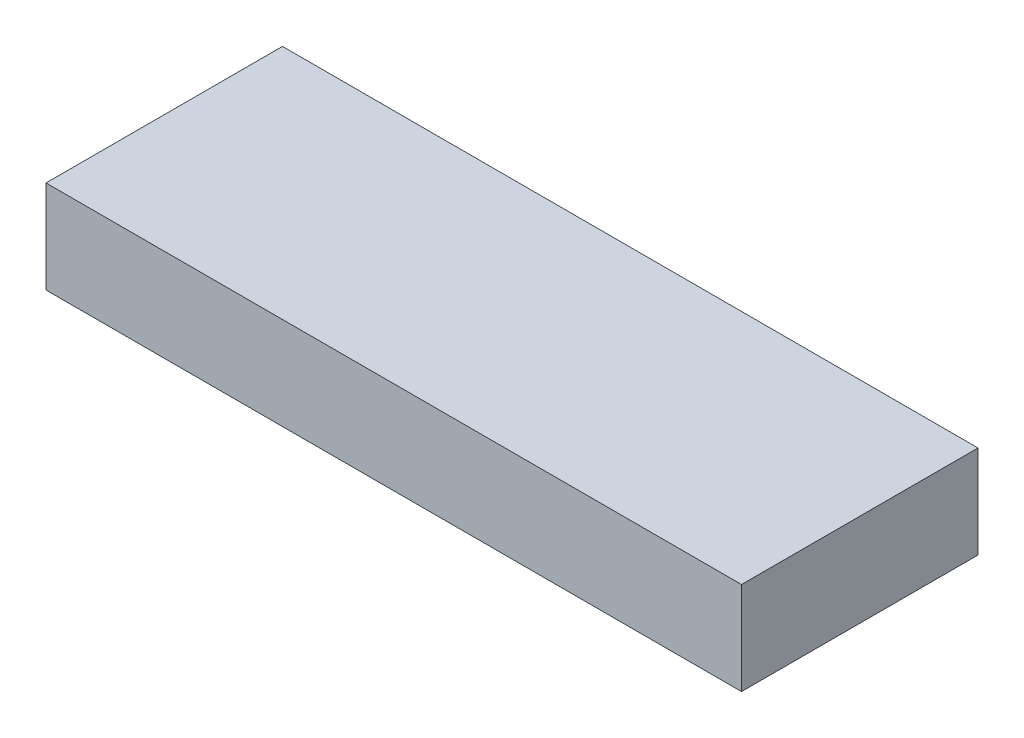
ISO-10303-21;
HEADER;
FILE_DESCRIPTION(('STEP AP214'),'2;1');
FILE_NAME('part.step','',(''),(''),'','','');
FILE_SCHEMA(('AUTOMOTIVE_DESIGN { 1 0 10303 214 1 1 1 1 }'));
ENDSEC;
DATA;
#1=APPLICATION_CONTEXT('core data for automotive mechanical design processes');
#2=APPLICATION_PROTOCOL_DEFINITION('international standard','automotive_design',2000,#1);
#3=PRODUCT_CONTEXT('',#1,'mechanical');
#4=PRODUCT('Part','Part','',(#3));
#5=PRODUCT_RELATED_PRODUCT_CATEGORY('part','',(#4));
#6=PRODUCT_DEFINITION_FORMATION('','',#4);
#7=PRODUCT_DEFINITION_CONTEXT('part definition',#1,'design');
#8=PRODUCT_DEFINITION('design','',#6,#7);
#9=PRODUCT_DEFINITION_SHAPE('','',#8);
#10=(LENGTH_UNIT() NAMED_UNIT(*) SI_UNIT(.MILLI.,.METRE.));
#11=(NAMED_UNIT(*) PLANE_ANGLE_UNIT() SI_UNIT($,.RADIAN.));
#12=(NAMED_UNIT(*) SI_UNIT($,.STERADIAN.) SOLID_ANGLE_UNIT());
#13=UNCERTAINTY_MEASURE_WITH_UNIT(LENGTH_MEASURE(1.E-05),#10,'distance_accuracy_value','');
#14=(GEOMETRIC_REPRESENTATION_CONTEXT(3) GLOBAL_UNCERTAINTY_ASSIGNED_CONTEXT((#13)) GLOBAL_UNIT_ASSIGNED_CONTEXT((#10,
#11,#12)) REPRESENTATION_CONTEXT('',''));
#15=CARTESIAN_POINT('',(0.,0.,0.));
#16=DIRECTION('',(0.,0.,1.));
#17=DIRECTION('',(1.,0.,0.));
#18=AXIS2_PLACEMENT_3D('',#15,#16,#17);
#19=CARTESIAN_POINT('',(75.,20.,25.5));
#20=DIRECTION('',(-1.,0.,0.));
#21=DIRECTION('',(0.,0.,1.));
#22=AXIS2_PLACEMENT_3D('',#19,#20,#21);
#23=PLANE('',#22);
#24=DIRECTION('',(0.,0.,-1.));
#25=VECTOR('',#24,1.);
#26=CARTESIAN_POINT('',(75.,0.,25.5));
#27=LINE('',#26,#25);
#28=CARTESIAN_POINT('',(75.,0.,25.5));
#29=VERTEX_POINT('',#28);
#30=CARTESIAN_POINT('',(75.,0.,-25.5));
#31=VERTEX_POINT('',#30);
#32=EDGE_CURVE('E98',#29,#31,#27,.T.);
#33=ORIENTED_EDGE('',*,*,#32,.T.);
#34=DIRECTION('',(0.,-1.,0.));
#35=VECTOR('',#34,1.);
#36=CARTESIAN_POINT('',(75.,20.,-25.5));
#37=LINE('',#36,#35);
#38=CARTESIAN_POINT('',(75.,20.,-25.5));
#39=VERTEX_POINT('',#38);
#40=EDGE_CURVE('E11',#39,#31,#37,.T.);
#41=ORIENTED_EDGE('',*,*,#40,.F.);
#42=DIRECTION('',(0.,0.,-1.));
#43=VECTOR('',#42,1.);
#44=CARTESIAN_POINT('',(75.,20.,25.5));
#45=LINE('',#44,#43);
#46=CARTESIAN_POINT('',(75.,20.,25.5));
#47=VERTEX_POINT('',#46);
#48=EDGE_CURVE('E86',#47,#39,#45,.T.);
#49=ORIENTED_EDGE('',*,*,#48,.F.);
#50=DIRECTION('',(0.,-1.,0.));
#51=VECTOR('',#50,1.);
#52=CARTESIAN_POINT('',(75.,20.,25.5));
#53=LINE('',#52,#51);
#54=EDGE_CURVE('E94',#47,#29,#53,.T.);
#55=ORIENTED_EDGE('',*,*,#54,.T.);
#56=EDGE_LOOP('',(#33,#41,#49,#55));
#57=FACE_BOUND('',#56,.T.);
#58=ADVANCED_FACE('F35',(#57),#23,.F.);
#59=CARTESIAN_POINT('',(-75.,20.,-25.5));
#60=DIRECTION('',(0.,0.,1.));
#61=DIRECTION('',(1.,0.,0.));
#62=AXIS2_PLACEMENT_3D('',#59,#60,#61);
#63=PLANE('',#62);
#64=DIRECTION('',(-1.,0.,0.));
#65=VECTOR('',#64,1.);
#66=CARTESIAN_POINT('',(-75.,0.,-25.5));
#67=LINE('',#66,#65);
#68=CARTESIAN_POINT('',(-75.,0.,-25.5));
#69=VERTEX_POINT('',#68);
#70=EDGE_CURVE('E90',#31,#69,#67,.T.);
#71=ORIENTED_EDGE('',*,*,#70,.T.);
#72=DIRECTION('',(0.,-1.,0.));
#73=VECTOR('',#72,1.);
#74=CARTESIAN_POINT('',(-75.,20.,-25.5));
#75=LINE('',#74,#73);
#76=CARTESIAN_POINT('',(-75.,20.,-25.5));
#77=VERTEX_POINT('',#76);
#78=EDGE_CURVE('E43',#77,#69,#75,.T.);
#79=ORIENTED_EDGE('',*,*,#78,.F.);
#80=DIRECTION('',(-1.,0.,0.));
#81=VECTOR('',#80,1.);
#82=CARTESIAN_POINT('',(-75.,20.,-25.5));
#83=LINE('',#82,#81);
#84=EDGE_CURVE('E81',#39,#77,#83,.T.);
#85=ORIENTED_EDGE('',*,*,#84,.F.);
#86=ORIENTED_EDGE('',*,*,#40,.T.);
#87=EDGE_LOOP('',(#71,#79,#85,#86));
#88=FACE_BOUND('',#87,.T.);
#89=ADVANCED_FACE('F89',(#88),#63,.F.);
#90=CARTESIAN_POINT('',(-75.,20.,25.5));
#91=DIRECTION('',(1.,0.,0.));
#92=DIRECTION('',(0.,0.,-1.));
#93=AXIS2_PLACEMENT_3D('',#90,#91,#92);
#94=PLANE('',#93);
#95=DIRECTION('',(0.,0.,1.));
#96=VECTOR('',#95,1.);
#97=CARTESIAN_POINT('',(-75.,0.,25.5));
#98=LINE('',#97,#96);
#99=CARTESIAN_POINT('',(-75.,0.,25.5));
#100=VERTEX_POINT('',#99);
#101=EDGE_CURVE('E68',#69,#100,#98,.T.);
#102=ORIENTED_EDGE('',*,*,#101,.T.);
#103=DIRECTION('',(0.,-1.,0.));
#104=VECTOR('',#103,1.);
#105=CARTESIAN_POINT('',(-75.,20.,25.5));
#106=LINE('',#105,#104);
#107=CARTESIAN_POINT('',(-75.,20.,25.5));
#108=VERTEX_POINT('',#107);
#109=EDGE_CURVE('E91',#108,#100,#106,.T.);
#110=ORIENTED_EDGE('',*,*,#109,.F.);
#111=DIRECTION('',(0.,0.,1.));
#112=VECTOR('',#111,1.);
#113=CARTESIAN_POINT('',(-75.,20.,25.5));
#114=LINE('',#113,#112);
#115=EDGE_CURVE('E84',#77,#108,#114,.T.);
#116=ORIENTED_EDGE('',*,*,#115,.F.);
#117=ORIENTED_EDGE('',*,*,#78,.T.);
#118=EDGE_LOOP('',(#102,#110,#116,#117));
#119=FACE_BOUND('',#118,.T.);
#120=ADVANCED_FACE('F92',(#119),#94,.F.);
#121=CARTESIAN_POINT('',(-75.,20.,25.5));
#122=DIRECTION('',(0.,0.,-1.));
#123=DIRECTION('',(-1.,0.,0.));
#124=AXIS2_PLACEMENT_3D('',#121,#122,#123);
#125=PLANE('',#124);
#126=DIRECTION('',(1.,0.,0.));
#127=VECTOR('',#126,1.);
#128=CARTESIAN_POINT('',(-75.,0.,25.5));
#129=LINE('',#128,#127);
#130=EDGE_CURVE('E74',#100,#29,#129,.T.);
#131=ORIENTED_EDGE('',*,*,#130,.T.);
#132=ORIENTED_EDGE('',*,*,#54,.F.);
#133=DIRECTION('',(1.,0.,0.));
#134=VECTOR('',#133,1.);
#135=CARTESIAN_POINT('',(-75.,20.,25.5));
#136=LINE('',#135,#134);
#137=EDGE_CURVE('E51',#108,#47,#136,.T.);
#138=ORIENTED_EDGE('',*,*,#137,.F.);
#139=ORIENTED_EDGE('',*,*,#109,.T.);
#140=EDGE_LOOP('',(#131,#132,#138,#139));
#141=FACE_BOUND('',#140,.T.);
#142=ADVANCED_FACE('F105',(#141),#125,.F.);
#143=CARTESIAN_POINT('',(0.,20.,0.));
#144=DIRECTION('',(0.,-1.,0.));
#145=DIRECTION('',(0.,0.,-1.));
#146=AXIS2_PLACEMENT_3D('',#143,#144,#145);
#147=PLANE('',#146);
#148=ORIENTED_EDGE('',*,*,#48,.T.);
#149=ORIENTED_EDGE('',*,*,#84,.T.);
#150=ORIENTED_EDGE('',*,*,#115,.T.);
#151=ORIENTED_EDGE('',*,*,#137,.T.);
#152=EDGE_LOOP('',(#148,#149,#150,#151));
#153=FACE_BOUND('',#152,.T.);
#154=ADVANCED_FACE('F82',(#153),#147,.F.);
#155=CARTESIAN_POINT('',(0.,0.,0.));
#156=DIRECTION('',(0.,-1.,0.));
#157=DIRECTION('',(0.,0.,-1.));
#158=AXIS2_PLACEMENT_3D('',#155,#156,#157);
#159=PLANE('',#158);
#160=ORIENTED_EDGE('',*,*,#32,.F.);
#161=ORIENTED_EDGE('',*,*,#130,.F.);
#162=ORIENTED_EDGE('',*,*,#101,.F.);
#163=ORIENTED_EDGE('',*,*,#70,.F.);
#164=EDGE_LOOP('',(#160,#161,#162,#163));
#165=FACE_BOUND('',#164,.T.);
#166=ADVANCED_FACE('F108',(#165),#159,.T.);
#167=CLOSED_SHELL('',(#58,#89,#120,#142,#154,#166));
#168=MANIFOLD_SOLID_BREP('B2',#167);
#169=ADVANCED_BREP_SHAPE_REPRESENTATION('',(#18,#168),#14);
#170=SHAPE_DEFINITION_REPRESENTATION(#9,#169);
ENDSEC;
END-ISO-10303-21;
